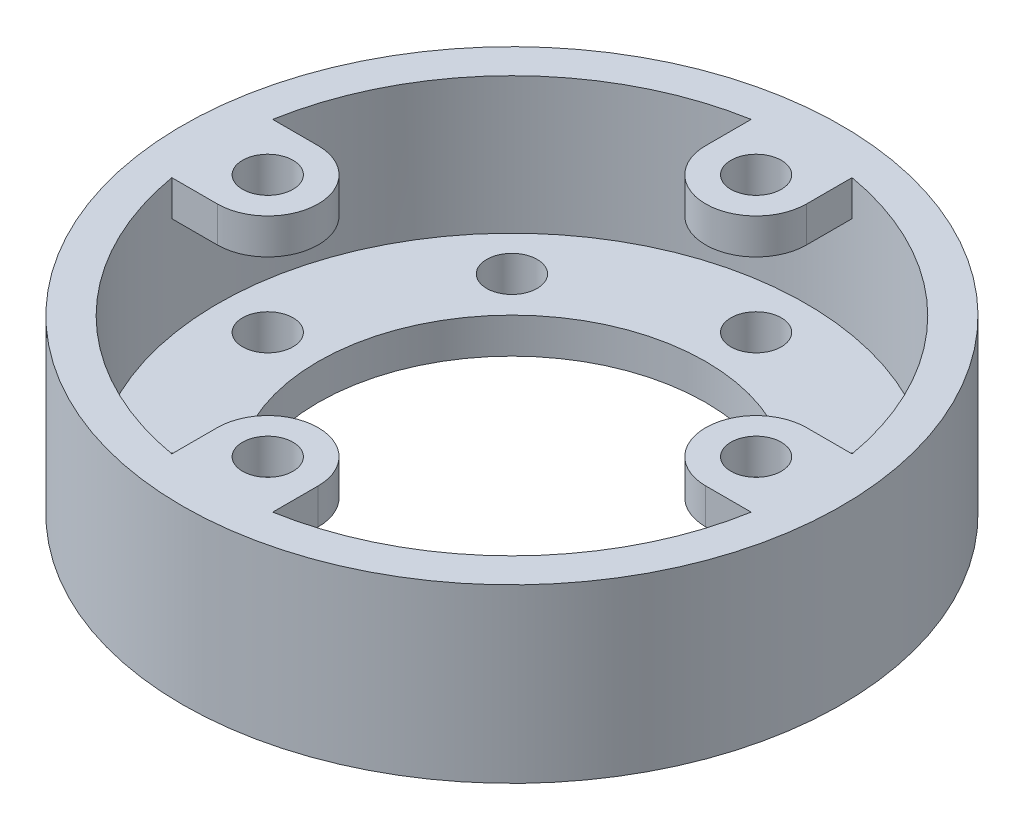
ISO-10303-21;
HEADER;
FILE_DESCRIPTION(('STEP AP214'),'2;1');
FILE_NAME('part.step','',(''),(''),'','','');
FILE_SCHEMA(('AUTOMOTIVE_DESIGN { 1 0 10303 214 1 1 1 1 }'));
ENDSEC;
DATA;
#1=APPLICATION_CONTEXT('core data for automotive mechanical design processes');
#2=APPLICATION_PROTOCOL_DEFINITION('international standard','automotive_design',2000,#1);
#3=PRODUCT_CONTEXT('',#1,'mechanical');
#4=PRODUCT('Part','Part','',(#3));
#5=PRODUCT_RELATED_PRODUCT_CATEGORY('part','',(#4));
#6=PRODUCT_DEFINITION_FORMATION('','',#4);
#7=PRODUCT_DEFINITION_CONTEXT('part definition',#1,'design');
#8=PRODUCT_DEFINITION('design','',#6,#7);
#9=PRODUCT_DEFINITION_SHAPE('','',#8);
#10=(LENGTH_UNIT() NAMED_UNIT(*) SI_UNIT(.MILLI.,.METRE.));
#11=(NAMED_UNIT(*) PLANE_ANGLE_UNIT() SI_UNIT($,.RADIAN.));
#12=(NAMED_UNIT(*) SI_UNIT($,.STERADIAN.) SOLID_ANGLE_UNIT());
#13=UNCERTAINTY_MEASURE_WITH_UNIT(LENGTH_MEASURE(1.E-05),#10,'distance_accuracy_value','');
#14=(GEOMETRIC_REPRESENTATION_CONTEXT(3) GLOBAL_UNCERTAINTY_ASSIGNED_CONTEXT((#13)) GLOBAL_UNIT_ASSIGNED_CONTEXT((#10,
#11,#12)) REPRESENTATION_CONTEXT('',''));
#15=CARTESIAN_POINT('',(0.,0.,0.));
#16=DIRECTION('',(0.,0.,1.));
#17=DIRECTION('',(1.,0.,0.));
#18=AXIS2_PLACEMENT_3D('',#15,#16,#17);
#19=CARTESIAN_POINT('',(0.,7.874,0.));
#20=DIRECTION('',(0.,1.,0.));
#21=DIRECTION('',(0.,0.,1.));
#22=AXIS2_PLACEMENT_3D('',#19,#20,#21);
#23=PLANE('',#22);
#24=CARTESIAN_POINT('',(38.2558910757541,7.874,38.255891075755));
#25=DIRECTION('',(0.,1.,0.));
#26=DIRECTION('',(0.,0.,1.));
#27=AXIS2_PLACEMENT_3D('',#24,#25,#26);
#28=CIRCLE('',#27,5.588);
#29=CARTESIAN_POINT('',(38.2558910757541,7.874,43.843891075755));
#30=VERTEX_POINT('',#29);
#31=EDGE_CURVE('E277',#30,#30,#28,.T.);
#32=ORIENTED_EDGE('',*,*,#31,.F.);
#33=EDGE_LOOP('',(#32));
#34=FACE_BOUND('',#33,.T.);
#35=CARTESIAN_POINT('',(38.2558910757549,7.874,-38.2558910757543));
#36=DIRECTION('',(0.,1.,0.));
#37=DIRECTION('',(0.,0.,1.));
#38=AXIS2_PLACEMENT_3D('',#35,#36,#37);
#39=CIRCLE('',#38,5.58799999999999);
#40=CARTESIAN_POINT('',(38.2558910757549,7.874,-32.6678910757543));
#41=VERTEX_POINT('',#40);
#42=EDGE_CURVE('E289',#41,#41,#39,.T.);
#43=ORIENTED_EDGE('',*,*,#42,.F.);
#44=EDGE_LOOP('',(#43));
#45=FACE_BOUND('',#44,.T.);
#46=CARTESIAN_POINT('',(-38.2558910757544,7.874,-38.2558910757548));
#47=DIRECTION('',(0.,1.,0.));
#48=DIRECTION('',(0.,0.,1.));
#49=AXIS2_PLACEMENT_3D('',#46,#47,#48);
#50=CIRCLE('',#49,5.588);
#51=CARTESIAN_POINT('',(-38.2558910757544,7.874,-32.6678910757548));
#52=VERTEX_POINT('',#51);
#53=EDGE_CURVE('E301',#52,#52,#50,.T.);
#54=ORIENTED_EDGE('',*,*,#53,.F.);
#55=EDGE_LOOP('',(#54));
#56=FACE_BOUND('',#55,.T.);
#57=CARTESIAN_POINT('',(-38.2558910757547,7.874,38.2558910757545));
#58=DIRECTION('',(0.,1.,0.));
#59=DIRECTION('',(0.,0.,1.));
#60=AXIS2_PLACEMENT_3D('',#57,#58,#59);
#61=CIRCLE('',#60,5.588);
#62=CARTESIAN_POINT('',(-38.2558910757547,7.874,43.8438910757545));
#63=VERTEX_POINT('',#62);
#64=EDGE_CURVE('E313',#63,#63,#61,.T.);
#65=ORIENTED_EDGE('',*,*,#64,.F.);
#66=EDGE_LOOP('',(#65));
#67=FACE_BOUND('',#66,.T.);
#68=CARTESIAN_POINT('',(0.,7.874,0.));
#69=DIRECTION('',(0.,1.,0.));
#70=DIRECTION('',(0.,0.,1.));
#71=AXIS2_PLACEMENT_3D('',#68,#69,#70);
#72=CIRCLE('',#71,42.926);
#73=CARTESIAN_POINT('',(0.,7.874,42.926));
#74=VERTEX_POINT('',#73);
#75=EDGE_CURVE('E325',#74,#74,#72,.T.);
#76=ORIENTED_EDGE('',*,*,#75,.F.);
#77=EDGE_LOOP('',(#76));
#78=FACE_BOUND('',#77,.T.);
#79=CARTESIAN_POINT('',(0.,7.874,54.102));
#80=DIRECTION('',(0.,1.,0.));
#81=DIRECTION('',(0.,0.,1.));
#82=AXIS2_PLACEMENT_3D('',#79,#80,#81);
#83=CIRCLE('',#82,5.588);
#84=CARTESIAN_POINT('',(0.,7.874,59.69));
#85=VERTEX_POINT('',#84);
#86=EDGE_CURVE('E319',#85,#85,#83,.T.);
#87=ORIENTED_EDGE('',*,*,#86,.F.);
#88=EDGE_LOOP('',(#87));
#89=FACE_BOUND('',#88,.T.);
#90=CARTESIAN_POINT('',(-54.102,7.874,-1.88896123394091E-13));
#91=DIRECTION('',(0.,1.,0.));
#92=DIRECTION('',(0.,0.,1.));
#93=AXIS2_PLACEMENT_3D('',#90,#91,#92);
#94=CIRCLE('',#93,5.588);
#95=CARTESIAN_POINT('',(-54.102,7.874,5.58799999999981));
#96=VERTEX_POINT('',#95);
#97=EDGE_CURVE('E307',#96,#96,#94,.T.);
#98=ORIENTED_EDGE('',*,*,#97,.F.);
#99=EDGE_LOOP('',(#98));
#100=FACE_BOUND('',#99,.T.);
#101=CARTESIAN_POINT('',(3.77792246788182E-13,7.874,-54.102));
#102=DIRECTION('',(0.,1.,0.));
#103=DIRECTION('',(0.,0.,1.));
#104=AXIS2_PLACEMENT_3D('',#101,#102,#103);
#105=CIRCLE('',#104,5.588);
#106=CARTESIAN_POINT('',(3.77792246788182E-13,7.874,-48.514));
#107=VERTEX_POINT('',#106);
#108=EDGE_CURVE('E295',#107,#107,#105,.T.);
#109=ORIENTED_EDGE('',*,*,#108,.F.);
#110=EDGE_LOOP('',(#109));
#111=FACE_BOUND('',#110,.T.);
#112=CARTESIAN_POINT('',(54.102,7.874,5.66688370182274E-13));
#113=DIRECTION('',(0.,1.,0.));
#114=DIRECTION('',(0.,0.,1.));
#115=AXIS2_PLACEMENT_3D('',#112,#113,#114);
#116=CIRCLE('',#115,5.588);
#117=CARTESIAN_POINT('',(54.102,7.874,5.58800000000057));
#118=VERTEX_POINT('',#117);
#119=EDGE_CURVE('E283',#118,#118,#116,.T.);
#120=ORIENTED_EDGE('',*,*,#119,.F.);
#121=EDGE_LOOP('',(#120));
#122=FACE_BOUND('',#121,.T.);
#123=CARTESIAN_POINT('',(0.,7.874,0.));
#124=DIRECTION('',(0.,1.,0.));
#125=DIRECTION('',(0.,0.,1.));
#126=AXIS2_PLACEMENT_3D('',#123,#124,#125);
#127=CIRCLE('',#126,65.151);
#128=CARTESIAN_POINT('',(0.,7.874,65.151));
#129=VERTEX_POINT('',#128);
#130=EDGE_CURVE('E333',#129,#129,#127,.F.);
#131=ORIENTED_EDGE('',*,*,#130,.F.);
#132=EDGE_LOOP('',(#131));
#133=FACE_BOUND('',#132,.T.);
#134=ADVANCED_FACE('F43',(#34,#45,#56,#67,#78,#89,#100,#111,#122,#133),#23,.T.);
#135=CARTESIAN_POINT('',(0.,0.,0.));
#136=DIRECTION('',(0.,1.,0.));
#137=DIRECTION('',(0.,0.,1.));
#138=AXIS2_PLACEMENT_3D('',#135,#136,#137);
#139=PLANE('',#138);
#140=CARTESIAN_POINT('',(0.,0.,0.));
#141=DIRECTION('',(0.,1.,0.));
#142=DIRECTION('',(0.,0.,1.));
#143=AXIS2_PLACEMENT_3D('',#140,#141,#142);
#144=CIRCLE('',#143,73.025);
#145=CARTESIAN_POINT('',(0.,0.,73.025));
#146=VERTEX_POINT('',#145);
#147=EDGE_CURVE('E328',#146,#146,#144,.T.);
#148=ORIENTED_EDGE('',*,*,#147,.F.);
#149=EDGE_LOOP('',(#148));
#150=FACE_BOUND('',#149,.T.);
#151=CARTESIAN_POINT('',(0.,0.,0.));
#152=DIRECTION('',(0.,1.,0.));
#153=DIRECTION('',(0.,0.,1.));
#154=AXIS2_PLACEMENT_3D('',#151,#152,#153);
#155=CIRCLE('',#154,42.926);
#156=CARTESIAN_POINT('',(0.,0.,42.926));
#157=VERTEX_POINT('',#156);
#158=EDGE_CURVE('E322',#157,#157,#155,.T.);
#159=ORIENTED_EDGE('',*,*,#158,.T.);
#160=EDGE_LOOP('',(#159));
#161=FACE_BOUND('',#160,.T.);
#162=CARTESIAN_POINT('',(0.,0.,54.102));
#163=DIRECTION('',(0.,1.,0.));
#164=DIRECTION('',(0.,0.,1.));
#165=AXIS2_PLACEMENT_3D('',#162,#163,#164);
#166=CIRCLE('',#165,5.588);
#167=CARTESIAN_POINT('',(0.,0.,59.69));
#168=VERTEX_POINT('',#167);
#169=EDGE_CURVE('E316',#168,#168,#166,.T.);
#170=ORIENTED_EDGE('',*,*,#169,.T.);
#171=EDGE_LOOP('',(#170));
#172=FACE_BOUND('',#171,.T.);
#173=CARTESIAN_POINT('',(-38.2558910757547,0.,38.2558910757545));
#174=DIRECTION('',(0.,1.,0.));
#175=DIRECTION('',(0.,0.,1.));
#176=AXIS2_PLACEMENT_3D('',#173,#174,#175);
#177=CIRCLE('',#176,5.588);
#178=CARTESIAN_POINT('',(-38.2558910757547,0.,43.8438910757545));
#179=VERTEX_POINT('',#178);
#180=EDGE_CURVE('E310',#179,#179,#177,.T.);
#181=ORIENTED_EDGE('',*,*,#180,.T.);
#182=EDGE_LOOP('',(#181));
#183=FACE_BOUND('',#182,.T.);
#184=CARTESIAN_POINT('',(-54.102,0.,-1.88896123394091E-13));
#185=DIRECTION('',(0.,1.,0.));
#186=DIRECTION('',(0.,0.,1.));
#187=AXIS2_PLACEMENT_3D('',#184,#185,#186);
#188=CIRCLE('',#187,5.588);
#189=CARTESIAN_POINT('',(-54.102,0.,5.58799999999981));
#190=VERTEX_POINT('',#189);
#191=EDGE_CURVE('E304',#190,#190,#188,.T.);
#192=ORIENTED_EDGE('',*,*,#191,.T.);
#193=EDGE_LOOP('',(#192));
#194=FACE_BOUND('',#193,.T.);
#195=CARTESIAN_POINT('',(-38.2558910757544,0.,-38.2558910757548));
#196=DIRECTION('',(0.,1.,0.));
#197=DIRECTION('',(0.,0.,1.));
#198=AXIS2_PLACEMENT_3D('',#195,#196,#197);
#199=CIRCLE('',#198,5.588);
#200=CARTESIAN_POINT('',(-38.2558910757544,0.,-32.6678910757548));
#201=VERTEX_POINT('',#200);
#202=EDGE_CURVE('E298',#201,#201,#199,.T.);
#203=ORIENTED_EDGE('',*,*,#202,.T.);
#204=EDGE_LOOP('',(#203));
#205=FACE_BOUND('',#204,.T.);
#206=CARTESIAN_POINT('',(3.77792246788182E-13,0.,-54.102));
#207=DIRECTION('',(0.,1.,0.));
#208=DIRECTION('',(0.,0.,1.));
#209=AXIS2_PLACEMENT_3D('',#206,#207,#208);
#210=CIRCLE('',#209,5.588);
#211=CARTESIAN_POINT('',(3.77792246788182E-13,0.,-48.514));
#212=VERTEX_POINT('',#211);
#213=EDGE_CURVE('E292',#212,#212,#210,.T.);
#214=ORIENTED_EDGE('',*,*,#213,.T.);
#215=EDGE_LOOP('',(#214));
#216=FACE_BOUND('',#215,.T.);
#217=CARTESIAN_POINT('',(38.2558910757549,0.,-38.2558910757543));
#218=DIRECTION('',(0.,1.,0.));
#219=DIRECTION('',(0.,0.,1.));
#220=AXIS2_PLACEMENT_3D('',#217,#218,#219);
#221=CIRCLE('',#220,5.58799999999999);
#222=CARTESIAN_POINT('',(38.2558910757549,0.,-32.6678910757543));
#223=VERTEX_POINT('',#222);
#224=EDGE_CURVE('E286',#223,#223,#221,.T.);
#225=ORIENTED_EDGE('',*,*,#224,.T.);
#226=EDGE_LOOP('',(#225));
#227=FACE_BOUND('',#226,.T.);
#228=CARTESIAN_POINT('',(54.102,0.,5.66688370182274E-13));
#229=DIRECTION('',(0.,1.,0.));
#230=DIRECTION('',(0.,0.,1.));
#231=AXIS2_PLACEMENT_3D('',#228,#229,#230);
#232=CIRCLE('',#231,5.588);
#233=CARTESIAN_POINT('',(54.102,0.,5.58800000000057));
#234=VERTEX_POINT('',#233);
#235=EDGE_CURVE('E280',#234,#234,#232,.T.);
#236=ORIENTED_EDGE('',*,*,#235,.T.);
#237=EDGE_LOOP('',(#236));
#238=FACE_BOUND('',#237,.T.);
#239=CARTESIAN_POINT('',(38.2558910757541,0.,38.255891075755));
#240=DIRECTION('',(0.,1.,0.));
#241=DIRECTION('',(0.,0.,1.));
#242=AXIS2_PLACEMENT_3D('',#239,#240,#241);
#243=CIRCLE('',#242,5.588);
#244=CARTESIAN_POINT('',(38.2558910757541,0.,43.843891075755));
#245=VERTEX_POINT('',#244);
#246=EDGE_CURVE('E276',#245,#245,#243,.T.);
#247=ORIENTED_EDGE('',*,*,#246,.T.);
#248=EDGE_LOOP('',(#247));
#249=FACE_BOUND('',#248,.T.);
#250=ADVANCED_FACE('F397',(#150,#161,#172,#183,#194,#205,#216,#227,#238,#249),#139,.F.);
#251=CARTESIAN_POINT('',(0.,7.874,0.));
#252=DIRECTION('',(0.,-1.,0.));
#253=DIRECTION('',(0.,0.,-1.));
#254=AXIS2_PLACEMENT_3D('',#251,#252,#253);
#255=CYLINDRICAL_SURFACE('',#254,73.025);
#256=CARTESIAN_POINT('',(0.,38.1,0.));
#257=DIRECTION('',(0.,1.,0.));
#258=DIRECTION('',(0.,0.,1.));
#259=AXIS2_PLACEMENT_3D('',#256,#257,#258);
#260=CIRCLE('',#259,73.025);
#261=CARTESIAN_POINT('',(0.,38.1,73.025));
#262=VERTEX_POINT('',#261);
#263=EDGE_CURVE('E272',#262,#262,#260,.T.);
#264=ORIENTED_EDGE('',*,*,#263,.F.);
#265=EDGE_LOOP('',(#264));
#266=FACE_BOUND('',#265,.T.);
#267=ORIENTED_EDGE('',*,*,#147,.T.);
#268=EDGE_LOOP('',(#267));
#269=FACE_BOUND('',#268,.T.);
#270=ADVANCED_FACE('F45',(#266,#269),#255,.T.);
#271=CARTESIAN_POINT('',(0.,7.874,0.));
#272=DIRECTION('',(0.,-1.,0.));
#273=DIRECTION('',(0.,0.,-1.));
#274=AXIS2_PLACEMENT_3D('',#271,#272,#273);
#275=CYLINDRICAL_SURFACE('',#274,42.926);
#276=ORIENTED_EDGE('',*,*,#75,.T.);
#277=EDGE_LOOP('',(#276));
#278=FACE_BOUND('',#277,.T.);
#279=ORIENTED_EDGE('',*,*,#158,.F.);
#280=EDGE_LOOP('',(#279));
#281=FACE_BOUND('',#280,.T.);
#282=ADVANCED_FACE('F409',(#278,#281),#275,.F.);
#283=CARTESIAN_POINT('',(0.,7.874,54.102));
#284=DIRECTION('',(0.,-1.,0.));
#285=DIRECTION('',(0.,0.,-1.));
#286=AXIS2_PLACEMENT_3D('',#283,#284,#285);
#287=CYLINDRICAL_SURFACE('',#286,5.588);
#288=ORIENTED_EDGE('',*,*,#86,.T.);
#289=EDGE_LOOP('',(#288));
#290=FACE_BOUND('',#289,.T.);
#291=ORIENTED_EDGE('',*,*,#169,.F.);
#292=EDGE_LOOP('',(#291));
#293=FACE_BOUND('',#292,.T.);
#294=ADVANCED_FACE('F412',(#290,#293),#287,.F.);
#295=CARTESIAN_POINT('',(-38.2558910757547,7.874,38.2558910757545));
#296=DIRECTION('',(0.,-1.,0.));
#297=DIRECTION('',(0.,0.,-1.));
#298=AXIS2_PLACEMENT_3D('',#295,#296,#297);
#299=CYLINDRICAL_SURFACE('',#298,5.588);
#300=ORIENTED_EDGE('',*,*,#64,.T.);
#301=EDGE_LOOP('',(#300));
#302=FACE_BOUND('',#301,.T.);
#303=ORIENTED_EDGE('',*,*,#180,.F.);
#304=EDGE_LOOP('',(#303));
#305=FACE_BOUND('',#304,.T.);
#306=ADVANCED_FACE('F416',(#302,#305),#299,.F.);
#307=CARTESIAN_POINT('',(-54.102,7.874,-1.88896123394091E-13));
#308=DIRECTION('',(0.,-1.,0.));
#309=DIRECTION('',(0.,0.,-1.));
#310=AXIS2_PLACEMENT_3D('',#307,#308,#309);
#311=CYLINDRICAL_SURFACE('',#310,5.588);
#312=ORIENTED_EDGE('',*,*,#97,.T.);
#313=EDGE_LOOP('',(#312));
#314=FACE_BOUND('',#313,.T.);
#315=ORIENTED_EDGE('',*,*,#191,.F.);
#316=EDGE_LOOP('',(#315));
#317=FACE_BOUND('',#316,.T.);
#318=ADVANCED_FACE('F420',(#314,#317),#311,.F.);
#319=CARTESIAN_POINT('',(-38.2558910757544,7.874,-38.2558910757548));
#320=DIRECTION('',(0.,-1.,0.));
#321=DIRECTION('',(0.,0.,-1.));
#322=AXIS2_PLACEMENT_3D('',#319,#320,#321);
#323=CYLINDRICAL_SURFACE('',#322,5.588);
#324=ORIENTED_EDGE('',*,*,#53,.T.);
#325=EDGE_LOOP('',(#324));
#326=FACE_BOUND('',#325,.T.);
#327=ORIENTED_EDGE('',*,*,#202,.F.);
#328=EDGE_LOOP('',(#327));
#329=FACE_BOUND('',#328,.T.);
#330=ADVANCED_FACE('F424',(#326,#329),#323,.F.);
#331=CARTESIAN_POINT('',(3.77792246788182E-13,7.874,-54.102));
#332=DIRECTION('',(0.,-1.,0.));
#333=DIRECTION('',(0.,0.,-1.));
#334=AXIS2_PLACEMENT_3D('',#331,#332,#333);
#335=CYLINDRICAL_SURFACE('',#334,5.588);
#336=ORIENTED_EDGE('',*,*,#108,.T.);
#337=EDGE_LOOP('',(#336));
#338=FACE_BOUND('',#337,.T.);
#339=ORIENTED_EDGE('',*,*,#213,.F.);
#340=EDGE_LOOP('',(#339));
#341=FACE_BOUND('',#340,.T.);
#342=ADVANCED_FACE('F428',(#338,#341),#335,.F.);
#343=CARTESIAN_POINT('',(38.2558910757549,7.874,-38.2558910757543));
#344=DIRECTION('',(0.,-1.,0.));
#345=DIRECTION('',(0.,0.,-1.));
#346=AXIS2_PLACEMENT_3D('',#343,#344,#345);
#347=CYLINDRICAL_SURFACE('',#346,5.58799999999999);
#348=ORIENTED_EDGE('',*,*,#42,.T.);
#349=EDGE_LOOP('',(#348));
#350=FACE_BOUND('',#349,.T.);
#351=ORIENTED_EDGE('',*,*,#224,.F.);
#352=EDGE_LOOP('',(#351));
#353=FACE_BOUND('',#352,.T.);
#354=ADVANCED_FACE('F432',(#350,#353),#347,.F.);
#355=CARTESIAN_POINT('',(54.102,7.874,5.66688370182274E-13));
#356=DIRECTION('',(0.,-1.,0.));
#357=DIRECTION('',(0.,0.,-1.));
#358=AXIS2_PLACEMENT_3D('',#355,#356,#357);
#359=CYLINDRICAL_SURFACE('',#358,5.588);
#360=ORIENTED_EDGE('',*,*,#119,.T.);
#361=EDGE_LOOP('',(#360));
#362=FACE_BOUND('',#361,.T.);
#363=ORIENTED_EDGE('',*,*,#235,.F.);
#364=EDGE_LOOP('',(#363));
#365=FACE_BOUND('',#364,.T.);
#366=ADVANCED_FACE('F436',(#362,#365),#359,.F.);
#367=CARTESIAN_POINT('',(38.2558910757541,7.874,38.255891075755));
#368=DIRECTION('',(0.,-1.,0.));
#369=DIRECTION('',(0.,0.,-1.));
#370=AXIS2_PLACEMENT_3D('',#367,#368,#369);
#371=CYLINDRICAL_SURFACE('',#370,5.588);
#372=ORIENTED_EDGE('',*,*,#31,.T.);
#373=EDGE_LOOP('',(#372));
#374=FACE_BOUND('',#373,.T.);
#375=ORIENTED_EDGE('',*,*,#246,.F.);
#376=EDGE_LOOP('',(#375));
#377=FACE_BOUND('',#376,.T.);
#378=ADVANCED_FACE('F440',(#374,#377),#371,.F.);
#379=CARTESIAN_POINT('',(0.,38.1,0.));
#380=DIRECTION('',(0.,1.,0.));
#381=DIRECTION('',(0.,0.,1.));
#382=AXIS2_PLACEMENT_3D('',#379,#380,#381);
#383=PLANE('',#382);
#384=CARTESIAN_POINT('',(0.,38.1,0.));
#385=DIRECTION('',(0.,1.,0.));
#386=DIRECTION('',(0.,0.,1.));
#387=AXIS2_PLACEMENT_3D('',#384,#385,#386);
#388=CIRCLE('',#387,65.151);
#389=CARTESIAN_POINT('',(11.176,38.1,64.185277322763));
#390=VERTEX_POINT('',#389);
#391=CARTESIAN_POINT('',(64.1852773227629,38.1,11.1760000000007));
#392=VERTEX_POINT('',#391);
#393=EDGE_CURVE('E270',#390,#392,#388,.T.);
#394=ORIENTED_EDGE('',*,*,#393,.F.);
#395=DIRECTION('',(0.,0.,-1.));
#396=VECTOR('',#395,1.);
#397=CARTESIAN_POINT('',(11.176,38.1,72.164725794532));
#398=LINE('',#397,#396);
#399=CARTESIAN_POINT('',(11.176,38.1,54.102));
#400=VERTEX_POINT('',#399);
#401=EDGE_CURVE('E175',#390,#400,#398,.T.);
#402=ORIENTED_EDGE('',*,*,#401,.T.);
#403=CARTESIAN_POINT('',(0.,38.1,54.102));
#404=DIRECTION('',(0.,1.,0.));
#405=DIRECTION('',(0.,0.,1.));
#406=AXIS2_PLACEMENT_3D('',#403,#404,#405);
#407=CIRCLE('',#406,11.176);
#408=CARTESIAN_POINT('',(-11.176,38.1,54.102));
#409=VERTEX_POINT('',#408);
#410=EDGE_CURVE('E183',#400,#409,#407,.T.);
#411=ORIENTED_EDGE('',*,*,#410,.T.);
#412=DIRECTION('',(0.,0.,1.));
#413=VECTOR('',#412,1.);
#414=CARTESIAN_POINT('',(-11.176,38.1,54.102));
#415=LINE('',#414,#413);
#416=CARTESIAN_POINT('',(-11.176,38.1,64.185277322763));
#417=VERTEX_POINT('',#416);
#418=EDGE_CURVE('E158',#409,#417,#415,.T.);
#419=ORIENTED_EDGE('',*,*,#418,.T.);
#420=CARTESIAN_POINT('',(-64.1852773227631,38.1,11.1759999999998));
#421=VERTEX_POINT('',#420);
#422=EDGE_CURVE('E187',#421,#417,#388,.T.);
#423=ORIENTED_EDGE('',*,*,#422,.F.);
#424=DIRECTION('',(1.,0.,0.));
#425=VECTOR('',#424,1.);
#426=CARTESIAN_POINT('',(-72.1647257945321,38.1,11.1759999999997));
#427=LINE('',#426,#425);
#428=CARTESIAN_POINT('',(-54.102,38.1,11.1759999999998));
#429=VERTEX_POINT('',#428);
#430=EDGE_CURVE('E196',#421,#429,#427,.T.);
#431=ORIENTED_EDGE('',*,*,#430,.T.);
#432=CARTESIAN_POINT('',(-54.102,38.1,-1.88896123394091E-13));
#433=DIRECTION('',(0.,1.,0.));
#434=DIRECTION('',(0.,0.,1.));
#435=AXIS2_PLACEMENT_3D('',#432,#433,#434);
#436=CIRCLE('',#435,11.176);
#437=CARTESIAN_POINT('',(-54.102,38.1,-11.1760000000002));
#438=VERTEX_POINT('',#437);
#439=EDGE_CURVE('E202',#429,#438,#436,.T.);
#440=ORIENTED_EDGE('',*,*,#439,.T.);
#441=DIRECTION('',(-1.,0.,0.));
#442=VECTOR('',#441,1.);
#443=CARTESIAN_POINT('',(-54.102,38.1,-11.1760000000002));
#444=LINE('',#443,#442);
#445=CARTESIAN_POINT('',(-64.185277322763,38.1,-11.1760000000002));
#446=VERTEX_POINT('',#445);
#447=EDGE_CURVE('E198',#438,#446,#444,.T.);
#448=ORIENTED_EDGE('',*,*,#447,.T.);
#449=CARTESIAN_POINT('',(-11.1759999999996,38.1,-64.1852773227631));
#450=VERTEX_POINT('',#449);
#451=EDGE_CURVE('E537',#450,#446,#388,.T.);
#452=ORIENTED_EDGE('',*,*,#451,.F.);
#453=DIRECTION('',(0.,0.,1.));
#454=VECTOR('',#453,1.);
#455=CARTESIAN_POINT('',(-11.1759999999995,38.1,-72.1647257945321));
#456=LINE('',#455,#454);
#457=CARTESIAN_POINT('',(-11.1759999999996,38.1,-54.1020000000001));
#458=VERTEX_POINT('',#457);
#459=EDGE_CURVE('E224',#450,#458,#456,.T.);
#460=ORIENTED_EDGE('',*,*,#459,.T.);
#461=CARTESIAN_POINT('',(3.77792246788182E-13,38.1,-54.102));
#462=DIRECTION('',(0.,1.,0.));
#463=DIRECTION('',(0.,0.,1.));
#464=AXIS2_PLACEMENT_3D('',#461,#462,#463);
#465=CIRCLE('',#464,11.176);
#466=CARTESIAN_POINT('',(11.1760000000004,38.1,-54.1019999999999));
#467=VERTEX_POINT('',#466);
#468=EDGE_CURVE('E230',#458,#467,#465,.T.);
#469=ORIENTED_EDGE('',*,*,#468,.T.);
#470=DIRECTION('',(0.,0.,-1.));
#471=VECTOR('',#470,1.);
#472=CARTESIAN_POINT('',(11.1760000000004,38.1,-54.1019999999999));
#473=LINE('',#472,#471);
#474=CARTESIAN_POINT('',(11.1760000000004,38.1,-64.185277322763));
#475=VERTEX_POINT('',#474);
#476=EDGE_CURVE('E226',#467,#475,#473,.T.);
#477=ORIENTED_EDGE('',*,*,#476,.T.);
#478=CARTESIAN_POINT('',(64.1852773227631,38.1,-11.1759999999993));
#479=VERTEX_POINT('',#478);
#480=EDGE_CURVE('E273',#479,#475,#388,.T.);
#481=ORIENTED_EDGE('',*,*,#480,.F.);
#482=DIRECTION('',(-1.,0.,0.));
#483=VECTOR('',#482,1.);
#484=CARTESIAN_POINT('',(72.1647257945322,38.1,-11.1759999999992));
#485=LINE('',#484,#483);
#486=CARTESIAN_POINT('',(54.1020000000001,38.1,-11.1759999999994));
#487=VERTEX_POINT('',#486);
#488=EDGE_CURVE('E250',#479,#487,#485,.T.);
#489=ORIENTED_EDGE('',*,*,#488,.T.);
#490=CARTESIAN_POINT('',(54.102,38.1,5.66688370182274E-13));
#491=DIRECTION('',(0.,1.,0.));
#492=DIRECTION('',(0.,0.,1.));
#493=AXIS2_PLACEMENT_3D('',#490,#491,#492);
#494=CIRCLE('',#493,11.176);
#495=CARTESIAN_POINT('',(54.1019999999999,38.1,11.1760000000006));
#496=VERTEX_POINT('',#495);
#497=EDGE_CURVE('E256',#487,#496,#494,.T.);
#498=ORIENTED_EDGE('',*,*,#497,.T.);
#499=DIRECTION('',(1.,0.,0.));
#500=VECTOR('',#499,1.);
#501=CARTESIAN_POINT('',(54.1019999999999,38.1,11.1760000000006));
#502=LINE('',#501,#500);
#503=EDGE_CURVE('E252',#496,#392,#502,.T.);
#504=ORIENTED_EDGE('',*,*,#503,.T.);
#505=EDGE_LOOP('',(#394,#402,#411,#419,#423,#431,#440,#448,#452,#460,#469,#477,#481,#489,#498,#504));
#506=FACE_BOUND('',#505,.T.);
#507=ORIENTED_EDGE('',*,*,#263,.T.);
#508=EDGE_LOOP('',(#507));
#509=FACE_BOUND('',#508,.T.);
#510=CARTESIAN_POINT('',(54.102,38.1,5.66688370182274E-13));
#511=DIRECTION('',(0.,1.,0.));
#512=DIRECTION('',(0.,0.,1.));
#513=AXIS2_PLACEMENT_3D('',#510,#511,#512);
#514=CIRCLE('',#513,5.588);
#515=CARTESIAN_POINT('',(54.102,38.1,5.58800000000056));
#516=VERTEX_POINT('',#515);
#517=EDGE_CURVE('E223',#516,#516,#514,.T.);
#518=ORIENTED_EDGE('',*,*,#517,.F.);
#519=EDGE_LOOP('',(#518));
#520=FACE_BOUND('',#519,.T.);
#521=CARTESIAN_POINT('',(3.77792246788182E-13,38.1,-54.102));
#522=DIRECTION('',(0.,1.,0.));
#523=DIRECTION('',(0.,0.,1.));
#524=AXIS2_PLACEMENT_3D('',#521,#522,#523);
#525=CIRCLE('',#524,5.588);
#526=CARTESIAN_POINT('',(3.77792246788182E-13,38.1,-48.514));
#527=VERTEX_POINT('',#526);
#528=EDGE_CURVE('E195',#527,#527,#525,.T.);
#529=ORIENTED_EDGE('',*,*,#528,.F.);
#530=EDGE_LOOP('',(#529));
#531=FACE_BOUND('',#530,.T.);
#532=CARTESIAN_POINT('',(-54.102,38.1,-1.88896123394091E-13));
#533=DIRECTION('',(0.,1.,0.));
#534=DIRECTION('',(0.,0.,1.));
#535=AXIS2_PLACEMENT_3D('',#532,#533,#534);
#536=CIRCLE('',#535,5.588);
#537=CARTESIAN_POINT('',(-54.102,38.1,5.58799999999981));
#538=VERTEX_POINT('',#537);
#539=EDGE_CURVE('E212',#538,#538,#536,.T.);
#540=ORIENTED_EDGE('',*,*,#539,.F.);
#541=EDGE_LOOP('',(#540));
#542=FACE_BOUND('',#541,.T.);
#543=CARTESIAN_POINT('',(0.,38.1,54.102));
#544=DIRECTION('',(0.,1.,0.));
#545=DIRECTION('',(0.,0.,1.));
#546=AXIS2_PLACEMENT_3D('',#543,#544,#545);
#547=CIRCLE('',#546,5.588);
#548=CARTESIAN_POINT('',(0.,38.1,59.69));
#549=VERTEX_POINT('',#548);
#550=EDGE_CURVE('E179',#549,#549,#547,.T.);
#551=ORIENTED_EDGE('',*,*,#550,.F.);
#552=EDGE_LOOP('',(#551));
#553=FACE_BOUND('',#552,.T.);
#554=ADVANCED_FACE('F361',(#506,#509,#520,#531,#542,#553),#383,.T.);
#555=CARTESIAN_POINT('',(0.,38.1,0.));
#556=DIRECTION('',(0.,-1.,0.));
#557=DIRECTION('',(0.,0.,-1.));
#558=AXIS2_PLACEMENT_3D('',#555,#556,#557);
#559=CYLINDRICAL_SURFACE('',#558,65.151);
#560=DIRECTION('',(0.,-1.,0.));
#561=VECTOR('',#560,1.);
#562=CARTESIAN_POINT('',(11.176,38.1,64.185277322763));
#563=LINE('',#562,#561);
#564=CARTESIAN_POINT('',(11.176,30.226,64.185277322763));
#565=VERTEX_POINT('',#564);
#566=EDGE_CURVE('E11',#390,#565,#563,.T.);
#567=ORIENTED_EDGE('',*,*,#566,.F.);
#568=ORIENTED_EDGE('',*,*,#393,.T.);
#569=DIRECTION('',(0.,-1.,0.));
#570=VECTOR('',#569,1.);
#571=CARTESIAN_POINT('',(64.1852773227629,38.1,11.1760000000007));
#572=LINE('',#571,#570);
#573=CARTESIAN_POINT('',(64.1852773227629,30.226,11.1760000000007));
#574=VERTEX_POINT('',#573);
#575=EDGE_CURVE('E338',#574,#392,#572,.F.);
#576=ORIENTED_EDGE('',*,*,#575,.F.);
#577=CARTESIAN_POINT('',(0.,30.226,0.));
#578=DIRECTION('',(0.,1.,0.));
#579=DIRECTION('',(0.,0.,1.));
#580=AXIS2_PLACEMENT_3D('',#577,#578,#579);
#581=CIRCLE('',#580,65.151);
#582=CARTESIAN_POINT('',(64.1852773227631,30.226,-11.1759999999993));
#583=VERTEX_POINT('',#582);
#584=EDGE_CURVE('E336',#574,#583,#581,.T.);
#585=ORIENTED_EDGE('',*,*,#584,.T.);
#586=DIRECTION('',(0.,-1.,0.));
#587=VECTOR('',#586,1.);
#588=CARTESIAN_POINT('',(64.1852773227631,38.1,-11.1759999999993));
#589=LINE('',#588,#587);
#590=EDGE_CURVE('E341',#479,#583,#589,.T.);
#591=ORIENTED_EDGE('',*,*,#590,.F.);
#592=ORIENTED_EDGE('',*,*,#480,.T.);
#593=DIRECTION('',(0.,-1.,0.));
#594=VECTOR('',#593,1.);
#595=CARTESIAN_POINT('',(11.1760000000004,38.1,-64.185277322763));
#596=LINE('',#595,#594);
#597=CARTESIAN_POINT('',(11.1760000000004,30.226,-64.185277322763));
#598=VERTEX_POINT('',#597);
#599=EDGE_CURVE('E346',#598,#475,#596,.F.);
#600=ORIENTED_EDGE('',*,*,#599,.F.);
#601=CARTESIAN_POINT('',(0.,30.226,0.));
#602=DIRECTION('',(0.,1.,0.));
#603=DIRECTION('',(0.,0.,1.));
#604=AXIS2_PLACEMENT_3D('',#601,#602,#603);
#605=CIRCLE('',#604,65.151);
#606=CARTESIAN_POINT('',(-11.1759999999996,30.226,-64.1852773227631));
#607=VERTEX_POINT('',#606);
#608=EDGE_CURVE('E344',#598,#607,#605,.T.);
#609=ORIENTED_EDGE('',*,*,#608,.T.);
#610=DIRECTION('',(0.,-1.,0.));
#611=VECTOR('',#610,1.);
#612=CARTESIAN_POINT('',(-11.1759999999996,38.1,-64.1852773227631));
#613=LINE('',#612,#611);
#614=EDGE_CURVE('E349',#450,#607,#613,.T.);
#615=ORIENTED_EDGE('',*,*,#614,.F.);
#616=ORIENTED_EDGE('',*,*,#451,.T.);
#617=DIRECTION('',(0.,-1.,0.));
#618=VECTOR('',#617,1.);
#619=CARTESIAN_POINT('',(-64.185277322763,38.1,-11.1760000000002));
#620=LINE('',#619,#618);
#621=CARTESIAN_POINT('',(-64.185277322763,30.226,-11.1760000000002));
#622=VERTEX_POINT('',#621);
#623=EDGE_CURVE('E354',#622,#446,#620,.F.);
#624=ORIENTED_EDGE('',*,*,#623,.F.);
#625=CARTESIAN_POINT('',(0.,30.226,0.));
#626=DIRECTION('',(0.,1.,0.));
#627=DIRECTION('',(0.,0.,1.));
#628=AXIS2_PLACEMENT_3D('',#625,#626,#627);
#629=CIRCLE('',#628,65.151);
#630=CARTESIAN_POINT('',(-64.1852773227631,30.226,11.1759999999998));
#631=VERTEX_POINT('',#630);
#632=EDGE_CURVE('E352',#622,#631,#629,.T.);
#633=ORIENTED_EDGE('',*,*,#632,.T.);
#634=DIRECTION('',(0.,-1.,0.));
#635=VECTOR('',#634,1.);
#636=CARTESIAN_POINT('',(-64.1852773227631,38.1,11.1759999999998));
#637=LINE('',#636,#635);
#638=EDGE_CURVE('E357',#421,#631,#637,.T.);
#639=ORIENTED_EDGE('',*,*,#638,.F.);
#640=ORIENTED_EDGE('',*,*,#422,.T.);
#641=DIRECTION('',(0.,-1.,0.));
#642=VECTOR('',#641,1.);
#643=CARTESIAN_POINT('',(-11.176,38.1,64.185277322763));
#644=LINE('',#643,#642);
#645=CARTESIAN_POINT('',(-11.176,30.226,64.185277322763));
#646=VERTEX_POINT('',#645);
#647=EDGE_CURVE('E51',#646,#417,#644,.F.);
#648=ORIENTED_EDGE('',*,*,#647,.F.);
#649=CARTESIAN_POINT('',(0.,30.226,0.));
#650=DIRECTION('',(0.,1.,0.));
#651=DIRECTION('',(0.,0.,1.));
#652=AXIS2_PLACEMENT_3D('',#649,#650,#651);
#653=CIRCLE('',#652,65.151);
#654=EDGE_CURVE('E58',#646,#565,#653,.T.);
#655=ORIENTED_EDGE('',*,*,#654,.T.);
#656=EDGE_LOOP('',(#567,#568,#576,#585,#591,#592,#600,#609,#615,#616,#624,#633,#639,#640,#648,#655));
#657=FACE_BOUND('',#656,.T.);
#658=ORIENTED_EDGE('',*,*,#130,.T.);
#659=EDGE_LOOP('',(#658));
#660=FACE_BOUND('',#659,.T.);
#661=ADVANCED_FACE('F367',(#657,#660),#559,.F.);
#662=CARTESIAN_POINT('',(54.102,30.226,5.66688370182274E-13));
#663=DIRECTION('',(0.,1.,0.));
#664=DIRECTION('',(0.,0.,1.));
#665=AXIS2_PLACEMENT_3D('',#662,#663,#664);
#666=PLANE('',#665);
#667=CARTESIAN_POINT('',(54.102,30.226,5.66688370182274E-13));
#668=DIRECTION('',(0.,1.,0.));
#669=DIRECTION('',(0.,0.,1.));
#670=AXIS2_PLACEMENT_3D('',#667,#668,#669);
#671=CIRCLE('',#670,5.588);
#672=CARTESIAN_POINT('',(54.102,30.226,5.58800000000056));
#673=VERTEX_POINT('',#672);
#674=EDGE_CURVE('E259',#673,#673,#671,.T.);
#675=ORIENTED_EDGE('',*,*,#674,.T.);
#676=EDGE_LOOP('',(#675));
#677=FACE_BOUND('',#676,.T.);
#678=ORIENTED_EDGE('',*,*,#584,.F.);
#679=DIRECTION('',(1.,0.,0.));
#680=VECTOR('',#679,1.);
#681=CARTESIAN_POINT('',(54.1019999999999,30.226,11.1760000000006));
#682=LINE('',#681,#680);
#683=CARTESIAN_POINT('',(54.1019999999999,30.226,11.1760000000006));
#684=VERTEX_POINT('',#683);
#685=EDGE_CURVE('E261',#684,#574,#682,.T.);
#686=ORIENTED_EDGE('',*,*,#685,.F.);
#687=CARTESIAN_POINT('',(54.102,30.226,5.66688370182274E-13));
#688=DIRECTION('',(0.,1.,0.));
#689=DIRECTION('',(0.,0.,1.));
#690=AXIS2_PLACEMENT_3D('',#687,#688,#689);
#691=CIRCLE('',#690,11.176);
#692=CARTESIAN_POINT('',(54.1020000000001,30.226,-11.1759999999994));
#693=VERTEX_POINT('',#692);
#694=EDGE_CURVE('E253',#693,#684,#691,.T.);
#695=ORIENTED_EDGE('',*,*,#694,.F.);
#696=DIRECTION('',(-1.,0.,0.));
#697=VECTOR('',#696,1.);
#698=CARTESIAN_POINT('',(72.1647257945322,30.226,-11.1759999999992));
#699=LINE('',#698,#697);
#700=EDGE_CURVE('E246',#583,#693,#699,.T.);
#701=ORIENTED_EDGE('',*,*,#700,.F.);
#702=EDGE_LOOP('',(#678,#686,#695,#701));
#703=FACE_BOUND('',#702,.T.);
#704=ADVANCED_FACE('F381',(#677,#703),#666,.F.);
#705=CARTESIAN_POINT('',(54.102,30.226,5.66688370182274E-13));
#706=DIRECTION('',(0.,1.,0.));
#707=DIRECTION('',(0.,0.,1.));
#708=AXIS2_PLACEMENT_3D('',#705,#706,#707);
#709=CYLINDRICAL_SURFACE('',#708,11.176);
#710=ORIENTED_EDGE('',*,*,#497,.F.);
#711=DIRECTION('',(0.,1.,0.));
#712=VECTOR('',#711,1.);
#713=CARTESIAN_POINT('',(54.1020000000001,30.226,-11.1759999999994));
#714=LINE('',#713,#712);
#715=EDGE_CURVE('E247',#693,#487,#714,.T.);
#716=ORIENTED_EDGE('',*,*,#715,.F.);
#717=ORIENTED_EDGE('',*,*,#694,.T.);
#718=DIRECTION('',(0.,1.,0.));
#719=VECTOR('',#718,1.);
#720=CARTESIAN_POINT('',(54.1019999999999,30.226,11.1760000000006));
#721=LINE('',#720,#719);
#722=EDGE_CURVE('E244',#684,#496,#721,.T.);
#723=ORIENTED_EDGE('',*,*,#722,.T.);
#724=EDGE_LOOP('',(#710,#716,#717,#723));
#725=FACE_BOUND('',#724,.T.);
#726=ADVANCED_FACE('F378',(#725),#709,.T.);
#727=CARTESIAN_POINT('',(72.1647257945322,30.226,-11.1759999999992));
#728=DIRECTION('',(0.,0.,-1.));
#729=DIRECTION('',(-1.,0.,0.));
#730=AXIS2_PLACEMENT_3D('',#727,#728,#729);
#731=PLANE('',#730);
#732=ORIENTED_EDGE('',*,*,#488,.F.);
#733=ORIENTED_EDGE('',*,*,#590,.T.);
#734=ORIENTED_EDGE('',*,*,#700,.T.);
#735=ORIENTED_EDGE('',*,*,#715,.T.);
#736=EDGE_LOOP('',(#732,#733,#734,#735));
#737=FACE_BOUND('',#736,.T.);
#738=ADVANCED_FACE('F385',(#737),#731,.T.);
#739=CARTESIAN_POINT('',(54.1019999999999,30.226,11.1760000000006));
#740=DIRECTION('',(0.,0.,1.));
#741=DIRECTION('',(1.,0.,0.));
#742=AXIS2_PLACEMENT_3D('',#739,#740,#741);
#743=PLANE('',#742);
#744=ORIENTED_EDGE('',*,*,#685,.T.);
#745=ORIENTED_EDGE('',*,*,#575,.T.);
#746=ORIENTED_EDGE('',*,*,#503,.F.);
#747=ORIENTED_EDGE('',*,*,#722,.F.);
#748=EDGE_LOOP('',(#744,#745,#746,#747));
#749=FACE_BOUND('',#748,.T.);
#750=ADVANCED_FACE('F372',(#749),#743,.T.);
#751=CARTESIAN_POINT('',(54.102,30.226,5.66688370182274E-13));
#752=DIRECTION('',(0.,1.,0.));
#753=DIRECTION('',(0.,0.,1.));
#754=AXIS2_PLACEMENT_3D('',#751,#752,#753);
#755=CYLINDRICAL_SURFACE('',#754,5.588);
#756=ORIENTED_EDGE('',*,*,#674,.F.);
#757=EDGE_LOOP('',(#756));
#758=FACE_BOUND('',#757,.T.);
#759=ORIENTED_EDGE('',*,*,#517,.T.);
#760=EDGE_LOOP('',(#759));
#761=FACE_BOUND('',#760,.T.);
#762=ADVANCED_FACE('F392',(#758,#761),#755,.F.);
#763=CARTESIAN_POINT('',(3.77792246788182E-13,30.226,-54.102));
#764=DIRECTION('',(0.,1.,0.));
#765=DIRECTION('',(0.,0.,1.));
#766=AXIS2_PLACEMENT_3D('',#763,#764,#765);
#767=PLANE('',#766);
#768=CARTESIAN_POINT('',(3.77792246788182E-13,30.226,-54.102));
#769=DIRECTION('',(0.,1.,0.));
#770=DIRECTION('',(0.,0.,1.));
#771=AXIS2_PLACEMENT_3D('',#768,#769,#770);
#772=CIRCLE('',#771,5.588);
#773=CARTESIAN_POINT('',(3.77792246788182E-13,30.226,-48.514));
#774=VERTEX_POINT('',#773);
#775=EDGE_CURVE('E233',#774,#774,#772,.T.);
#776=ORIENTED_EDGE('',*,*,#775,.T.);
#777=EDGE_LOOP('',(#776));
#778=FACE_BOUND('',#777,.T.);
#779=ORIENTED_EDGE('',*,*,#608,.F.);
#780=DIRECTION('',(0.,0.,-1.));
#781=VECTOR('',#780,1.);
#782=CARTESIAN_POINT('',(11.1760000000004,30.226,-54.1019999999999));
#783=LINE('',#782,#781);
#784=CARTESIAN_POINT('',(11.1760000000004,30.226,-54.1019999999999));
#785=VERTEX_POINT('',#784);
#786=EDGE_CURVE('E235',#785,#598,#783,.T.);
#787=ORIENTED_EDGE('',*,*,#786,.F.);
#788=CARTESIAN_POINT('',(3.77792246788182E-13,30.226,-54.102));
#789=DIRECTION('',(0.,1.,0.));
#790=DIRECTION('',(0.,0.,1.));
#791=AXIS2_PLACEMENT_3D('',#788,#789,#790);
#792=CIRCLE('',#791,11.176);
#793=CARTESIAN_POINT('',(-11.1759999999996,30.226,-54.1020000000001));
#794=VERTEX_POINT('',#793);
#795=EDGE_CURVE('E227',#794,#785,#792,.T.);
#796=ORIENTED_EDGE('',*,*,#795,.F.);
#797=DIRECTION('',(0.,0.,1.));
#798=VECTOR('',#797,1.);
#799=CARTESIAN_POINT('',(-11.1759999999995,30.226,-72.1647257945321));
#800=LINE('',#799,#798);
#801=EDGE_CURVE('E219',#607,#794,#800,.T.);
#802=ORIENTED_EDGE('',*,*,#801,.F.);
#803=EDGE_LOOP('',(#779,#787,#796,#802));
#804=FACE_BOUND('',#803,.T.);
#805=ADVANCED_FACE('F449',(#778,#804),#767,.F.);
#806=CARTESIAN_POINT('',(3.77792246788182E-13,30.226,-54.102));
#807=DIRECTION('',(0.,1.,0.));
#808=DIRECTION('',(0.,0.,1.));
#809=AXIS2_PLACEMENT_3D('',#806,#807,#808);
#810=CYLINDRICAL_SURFACE('',#809,11.176);
#811=ORIENTED_EDGE('',*,*,#468,.F.);
#812=DIRECTION('',(0.,1.,0.));
#813=VECTOR('',#812,1.);
#814=CARTESIAN_POINT('',(-11.1759999999996,30.226,-54.1020000000001));
#815=LINE('',#814,#813);
#816=EDGE_CURVE('E220',#794,#458,#815,.T.);
#817=ORIENTED_EDGE('',*,*,#816,.F.);
#818=ORIENTED_EDGE('',*,*,#795,.T.);
#819=DIRECTION('',(0.,1.,0.));
#820=VECTOR('',#819,1.);
#821=CARTESIAN_POINT('',(11.1760000000004,30.226,-54.1019999999999));
#822=LINE('',#821,#820);
#823=EDGE_CURVE('E217',#785,#467,#822,.T.);
#824=ORIENTED_EDGE('',*,*,#823,.T.);
#825=EDGE_LOOP('',(#811,#817,#818,#824));
#826=FACE_BOUND('',#825,.T.);
#827=ADVANCED_FACE('F506',(#826),#810,.T.);
#828=CARTESIAN_POINT('',(-11.1759999999995,30.226,-72.1647257945321));
#829=DIRECTION('',(-1.,0.,0.));
#830=DIRECTION('',(0.,0.,1.));
#831=AXIS2_PLACEMENT_3D('',#828,#829,#830);
#832=PLANE('',#831);
#833=ORIENTED_EDGE('',*,*,#459,.F.);
#834=ORIENTED_EDGE('',*,*,#614,.T.);
#835=ORIENTED_EDGE('',*,*,#801,.T.);
#836=ORIENTED_EDGE('',*,*,#816,.T.);
#837=EDGE_LOOP('',(#833,#834,#835,#836));
#838=FACE_BOUND('',#837,.T.);
#839=ADVANCED_FACE('F509',(#838),#832,.T.);
#840=CARTESIAN_POINT('',(11.1760000000004,30.226,-54.1019999999999));
#841=DIRECTION('',(1.,0.,0.));
#842=DIRECTION('',(0.,0.,-1.));
#843=AXIS2_PLACEMENT_3D('',#840,#841,#842);
#844=PLANE('',#843);
#845=ORIENTED_EDGE('',*,*,#786,.T.);
#846=ORIENTED_EDGE('',*,*,#599,.T.);
#847=ORIENTED_EDGE('',*,*,#476,.F.);
#848=ORIENTED_EDGE('',*,*,#823,.F.);
#849=EDGE_LOOP('',(#845,#846,#847,#848));
#850=FACE_BOUND('',#849,.T.);
#851=ADVANCED_FACE('F511',(#850),#844,.T.);
#852=CARTESIAN_POINT('',(3.77792246788182E-13,30.226,-54.102));
#853=DIRECTION('',(0.,1.,0.));
#854=DIRECTION('',(0.,0.,1.));
#855=AXIS2_PLACEMENT_3D('',#852,#853,#854);
#856=CYLINDRICAL_SURFACE('',#855,5.588);
#857=ORIENTED_EDGE('',*,*,#775,.F.);
#858=EDGE_LOOP('',(#857));
#859=FACE_BOUND('',#858,.T.);
#860=ORIENTED_EDGE('',*,*,#528,.T.);
#861=EDGE_LOOP('',(#860));
#862=FACE_BOUND('',#861,.T.);
#863=ADVANCED_FACE('F501',(#859,#862),#856,.F.);
#864=CARTESIAN_POINT('',(-54.102,30.226,-1.88896123394091E-13));
#865=DIRECTION('',(0.,1.,0.));
#866=DIRECTION('',(0.,0.,1.));
#867=AXIS2_PLACEMENT_3D('',#864,#865,#866);
#868=PLANE('',#867);
#869=CARTESIAN_POINT('',(-54.102,30.226,-1.88896123394091E-13));
#870=DIRECTION('',(0.,1.,0.));
#871=DIRECTION('',(0.,0.,1.));
#872=AXIS2_PLACEMENT_3D('',#869,#870,#871);
#873=CIRCLE('',#872,5.588);
#874=CARTESIAN_POINT('',(-54.102,30.226,5.58799999999981));
#875=VERTEX_POINT('',#874);
#876=EDGE_CURVE('E205',#875,#875,#873,.T.);
#877=ORIENTED_EDGE('',*,*,#876,.T.);
#878=EDGE_LOOP('',(#877));
#879=FACE_BOUND('',#878,.T.);
#880=ORIENTED_EDGE('',*,*,#632,.F.);
#881=DIRECTION('',(-1.,0.,0.));
#882=VECTOR('',#881,1.);
#883=CARTESIAN_POINT('',(-54.102,30.226,-11.1760000000002));
#884=LINE('',#883,#882);
#885=CARTESIAN_POINT('',(-54.102,30.226,-11.1760000000002));
#886=VERTEX_POINT('',#885);
#887=EDGE_CURVE('E207',#886,#622,#884,.T.);
#888=ORIENTED_EDGE('',*,*,#887,.F.);
#889=CARTESIAN_POINT('',(-54.102,30.226,-1.88896123394091E-13));
#890=DIRECTION('',(0.,1.,0.));
#891=DIRECTION('',(0.,0.,1.));
#892=AXIS2_PLACEMENT_3D('',#889,#890,#891);
#893=CIRCLE('',#892,11.176);
#894=CARTESIAN_POINT('',(-54.102,30.226,11.1759999999998));
#895=VERTEX_POINT('',#894);
#896=EDGE_CURVE('E199',#895,#886,#893,.T.);
#897=ORIENTED_EDGE('',*,*,#896,.F.);
#898=DIRECTION('',(1.,0.,0.));
#899=VECTOR('',#898,1.);
#900=CARTESIAN_POINT('',(-72.1647257945321,30.226,11.1759999999997));
#901=LINE('',#900,#899);
#902=EDGE_CURVE('E191',#631,#895,#901,.T.);
#903=ORIENTED_EDGE('',*,*,#902,.F.);
#904=EDGE_LOOP('',(#880,#888,#897,#903));
#905=FACE_BOUND('',#904,.T.);
#906=ADVANCED_FACE('F490',(#879,#905),#868,.F.);
#907=CARTESIAN_POINT('',(-54.102,30.226,-1.88896123394091E-13));
#908=DIRECTION('',(0.,1.,0.));
#909=DIRECTION('',(0.,0.,1.));
#910=AXIS2_PLACEMENT_3D('',#907,#908,#909);
#911=CYLINDRICAL_SURFACE('',#910,11.176);
#912=ORIENTED_EDGE('',*,*,#439,.F.);
#913=DIRECTION('',(0.,1.,0.));
#914=VECTOR('',#913,1.);
#915=CARTESIAN_POINT('',(-54.102,30.226,11.1759999999998));
#916=LINE('',#915,#914);
#917=EDGE_CURVE('E192',#895,#429,#916,.T.);
#918=ORIENTED_EDGE('',*,*,#917,.F.);
#919=ORIENTED_EDGE('',*,*,#896,.T.);
#920=DIRECTION('',(0.,1.,0.));
#921=VECTOR('',#920,1.);
#922=CARTESIAN_POINT('',(-54.102,30.226,-11.1760000000002));
#923=LINE('',#922,#921);
#924=EDGE_CURVE('E189',#886,#438,#923,.T.);
#925=ORIENTED_EDGE('',*,*,#924,.T.);
#926=EDGE_LOOP('',(#912,#918,#919,#925));
#927=FACE_BOUND('',#926,.T.);
#928=ADVANCED_FACE('F486',(#927),#911,.T.);
#929=CARTESIAN_POINT('',(-72.1647257945321,30.226,11.1759999999997));
#930=DIRECTION('',(0.,0.,1.));
#931=DIRECTION('',(1.,0.,0.));
#932=AXIS2_PLACEMENT_3D('',#929,#930,#931);
#933=PLANE('',#932);
#934=ORIENTED_EDGE('',*,*,#430,.F.);
#935=ORIENTED_EDGE('',*,*,#638,.T.);
#936=ORIENTED_EDGE('',*,*,#902,.T.);
#937=ORIENTED_EDGE('',*,*,#917,.T.);
#938=EDGE_LOOP('',(#934,#935,#936,#937));
#939=FACE_BOUND('',#938,.T.);
#940=ADVANCED_FACE('F489',(#939),#933,.T.);
#941=CARTESIAN_POINT('',(-54.102,30.226,-11.1760000000002));
#942=DIRECTION('',(0.,0.,-1.));
#943=DIRECTION('',(-1.,0.,0.));
#944=AXIS2_PLACEMENT_3D('',#941,#942,#943);
#945=PLANE('',#944);
#946=ORIENTED_EDGE('',*,*,#887,.T.);
#947=ORIENTED_EDGE('',*,*,#623,.T.);
#948=ORIENTED_EDGE('',*,*,#447,.F.);
#949=ORIENTED_EDGE('',*,*,#924,.F.);
#950=EDGE_LOOP('',(#946,#947,#948,#949));
#951=FACE_BOUND('',#950,.T.);
#952=ADVANCED_FACE('F492',(#951),#945,.T.);
#953=CARTESIAN_POINT('',(-54.102,30.226,-1.88896123394091E-13));
#954=DIRECTION('',(0.,1.,0.));
#955=DIRECTION('',(0.,0.,1.));
#956=AXIS2_PLACEMENT_3D('',#953,#954,#955);
#957=CYLINDRICAL_SURFACE('',#956,5.588);
#958=ORIENTED_EDGE('',*,*,#876,.F.);
#959=EDGE_LOOP('',(#958));
#960=FACE_BOUND('',#959,.T.);
#961=ORIENTED_EDGE('',*,*,#539,.T.);
#962=EDGE_LOOP('',(#961));
#963=FACE_BOUND('',#962,.T.);
#964=ADVANCED_FACE('F481',(#960,#963),#957,.F.);
#965=CARTESIAN_POINT('',(0.,30.226,54.102));
#966=DIRECTION('',(0.,1.,0.));
#967=DIRECTION('',(0.,0.,1.));
#968=AXIS2_PLACEMENT_3D('',#965,#966,#967);
#969=PLANE('',#968);
#970=CARTESIAN_POINT('',(0.,30.226,54.102));
#971=DIRECTION('',(0.,1.,0.));
#972=DIRECTION('',(0.,0.,1.));
#973=AXIS2_PLACEMENT_3D('',#970,#971,#972);
#974=CIRCLE('',#973,5.588);
#975=CARTESIAN_POINT('',(0.,30.226,59.69));
#976=VERTEX_POINT('',#975);
#977=EDGE_CURVE('E185',#976,#976,#974,.T.);
#978=ORIENTED_EDGE('',*,*,#977,.T.);
#979=EDGE_LOOP('',(#978));
#980=FACE_BOUND('',#979,.T.);
#981=ORIENTED_EDGE('',*,*,#654,.F.);
#982=DIRECTION('',(0.,0.,1.));
#983=VECTOR('',#982,1.);
#984=CARTESIAN_POINT('',(-11.176,30.226,54.102));
#985=LINE('',#984,#983);
#986=CARTESIAN_POINT('',(-11.176,30.226,54.102));
#987=VERTEX_POINT('',#986);
#988=EDGE_CURVE('E156',#987,#646,#985,.T.);
#989=ORIENTED_EDGE('',*,*,#988,.F.);
#990=CARTESIAN_POINT('',(0.,30.226,54.102));
#991=DIRECTION('',(0.,1.,0.));
#992=DIRECTION('',(0.,0.,1.));
#993=AXIS2_PLACEMENT_3D('',#990,#991,#992);
#994=CIRCLE('',#993,11.176);
#995=CARTESIAN_POINT('',(11.176,30.226,54.102));
#996=VERTEX_POINT('',#995);
#997=EDGE_CURVE('E170',#996,#987,#994,.T.);
#998=ORIENTED_EDGE('',*,*,#997,.F.);
#999=DIRECTION('',(0.,0.,-1.));
#1000=VECTOR('',#999,1.);
#1001=CARTESIAN_POINT('',(11.176,30.226,72.164725794532));
#1002=LINE('',#1001,#1000);
#1003=EDGE_CURVE('E164',#565,#996,#1002,.T.);
#1004=ORIENTED_EDGE('',*,*,#1003,.F.);
#1005=EDGE_LOOP('',(#981,#989,#998,#1004));
#1006=FACE_BOUND('',#1005,.T.);
#1007=ADVANCED_FACE('F168',(#980,#1006),#969,.F.);
#1008=CARTESIAN_POINT('',(0.,30.226,54.102));
#1009=DIRECTION('',(0.,1.,0.));
#1010=DIRECTION('',(0.,0.,1.));
#1011=AXIS2_PLACEMENT_3D('',#1008,#1009,#1010);
#1012=CYLINDRICAL_SURFACE('',#1011,11.176);
#1013=ORIENTED_EDGE('',*,*,#410,.F.);
#1014=DIRECTION('',(0.,1.,0.));
#1015=VECTOR('',#1014,1.);
#1016=CARTESIAN_POINT('',(11.176,30.226,54.102));
#1017=LINE('',#1016,#1015);
#1018=EDGE_CURVE('E163',#996,#400,#1017,.T.);
#1019=ORIENTED_EDGE('',*,*,#1018,.F.);
#1020=ORIENTED_EDGE('',*,*,#997,.T.);
#1021=DIRECTION('',(0.,1.,0.));
#1022=VECTOR('',#1021,1.);
#1023=CARTESIAN_POINT('',(-11.176,30.226,54.102));
#1024=LINE('',#1023,#1022);
#1025=EDGE_CURVE('E153',#987,#409,#1024,.T.);
#1026=ORIENTED_EDGE('',*,*,#1025,.T.);
#1027=EDGE_LOOP('',(#1013,#1019,#1020,#1026));
#1028=FACE_BOUND('',#1027,.T.);
#1029=ADVANCED_FACE('F173',(#1028),#1012,.T.);
#1030=CARTESIAN_POINT('',(11.176,30.226,72.164725794532));
#1031=DIRECTION('',(1.,0.,0.));
#1032=DIRECTION('',(0.,0.,-1.));
#1033=AXIS2_PLACEMENT_3D('',#1030,#1031,#1032);
#1034=PLANE('',#1033);
#1035=ORIENTED_EDGE('',*,*,#401,.F.);
#1036=ORIENTED_EDGE('',*,*,#566,.T.);
#1037=ORIENTED_EDGE('',*,*,#1003,.T.);
#1038=ORIENTED_EDGE('',*,*,#1018,.T.);
#1039=EDGE_LOOP('',(#1035,#1036,#1037,#1038));
#1040=FACE_BOUND('',#1039,.T.);
#1041=ADVANCED_FACE('F366',(#1040),#1034,.T.);
#1042=CARTESIAN_POINT('',(-11.176,30.226,54.102));
#1043=DIRECTION('',(-1.,0.,0.));
#1044=DIRECTION('',(0.,0.,1.));
#1045=AXIS2_PLACEMENT_3D('',#1042,#1043,#1044);
#1046=PLANE('',#1045);
#1047=ORIENTED_EDGE('',*,*,#988,.T.);
#1048=ORIENTED_EDGE('',*,*,#647,.T.);
#1049=ORIENTED_EDGE('',*,*,#418,.F.);
#1050=ORIENTED_EDGE('',*,*,#1025,.F.);
#1051=EDGE_LOOP('',(#1047,#1048,#1049,#1050));
#1052=FACE_BOUND('',#1051,.T.);
#1053=ADVANCED_FACE('F155',(#1052),#1046,.T.);
#1054=CARTESIAN_POINT('',(0.,30.226,54.102));
#1055=DIRECTION('',(0.,1.,0.));
#1056=DIRECTION('',(0.,0.,1.));
#1057=AXIS2_PLACEMENT_3D('',#1054,#1055,#1056);
#1058=CYLINDRICAL_SURFACE('',#1057,5.588);
#1059=ORIENTED_EDGE('',*,*,#977,.F.);
#1060=EDGE_LOOP('',(#1059));
#1061=FACE_BOUND('',#1060,.T.);
#1062=ORIENTED_EDGE('',*,*,#550,.T.);
#1063=EDGE_LOOP('',(#1062));
#1064=FACE_BOUND('',#1063,.T.);
#1065=ADVANCED_FACE('F471',(#1061,#1064),#1058,.F.);
#1066=CLOSED_SHELL('',(#134,#250,#270,#282,#294,#306,#318,#330,#342,#354,#366,#378,#554,#661,
#704,#726,#738,#750,#762,#805,#827,#839,#851,#863,#906,#928,#940,#952,#964,#1007,#1029,#1041,
#1053,#1065));
#1067=MANIFOLD_SOLID_BREP('B2',#1066);
#1068=ADVANCED_BREP_SHAPE_REPRESENTATION('',(#18,#1067),#14);
#1069=SHAPE_DEFINITION_REPRESENTATION(#9,#1068);
ENDSEC;
END-ISO-10303-21;
